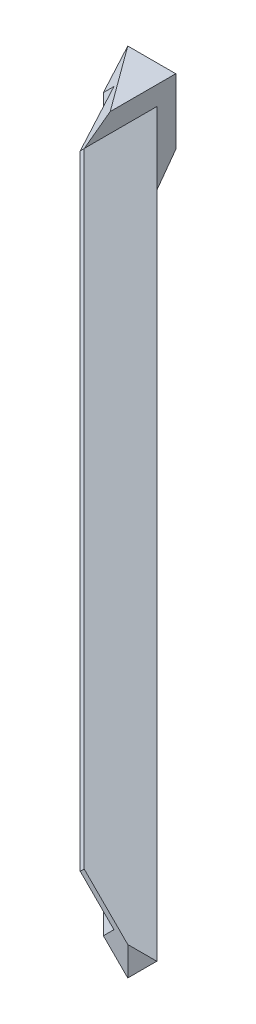
ISO-10303-21;
HEADER;
FILE_DESCRIPTION(('STEP AP214'),'2;1');
FILE_NAME('part.step','',(''),(''),'','','');
FILE_SCHEMA(('AUTOMOTIVE_DESIGN { 1 0 10303 214 1 1 1 1 }'));
ENDSEC;
DATA;
#1=APPLICATION_CONTEXT('core data for automotive mechanical design processes');
#2=APPLICATION_PROTOCOL_DEFINITION('international standard','automotive_design',2000,#1);
#3=PRODUCT_CONTEXT('',#1,'mechanical');
#4=PRODUCT('Part','Part','',(#3));
#5=PRODUCT_RELATED_PRODUCT_CATEGORY('part','',(#4));
#6=PRODUCT_DEFINITION_FORMATION('','',#4);
#7=PRODUCT_DEFINITION_CONTEXT('part definition',#1,'design');
#8=PRODUCT_DEFINITION('design','',#6,#7);
#9=PRODUCT_DEFINITION_SHAPE('','',#8);
#10=(LENGTH_UNIT() NAMED_UNIT(*) SI_UNIT(.MILLI.,.METRE.));
#11=(NAMED_UNIT(*) PLANE_ANGLE_UNIT() SI_UNIT($,.RADIAN.));
#12=(NAMED_UNIT(*) SI_UNIT($,.STERADIAN.) SOLID_ANGLE_UNIT());
#13=UNCERTAINTY_MEASURE_WITH_UNIT(LENGTH_MEASURE(1.E-05),#10,'distance_accuracy_value','');
#14=(GEOMETRIC_REPRESENTATION_CONTEXT(3) GLOBAL_UNCERTAINTY_ASSIGNED_CONTEXT((#13)) GLOBAL_UNIT_ASSIGNED_CONTEXT((#10,
#11,#12)) REPRESENTATION_CONTEXT('',''));
#15=CARTESIAN_POINT('',(0.,0.,0.));
#16=DIRECTION('',(0.,0.,1.));
#17=DIRECTION('',(1.,0.,0.));
#18=AXIS2_PLACEMENT_3D('',#15,#16,#17);
#19=CARTESIAN_POINT('',(0.,0.,0.));
#20=DIRECTION('',(0.,0.,1.));
#21=DIRECTION('',(1.,0.,0.));
#22=AXIS2_PLACEMENT_3D('',#19,#20,#21);
#23=PLANE('',#22);
#24=DIRECTION('',(-0.590690494568825,0.806898221355108,0.));
#25=VECTOR('',#24,1.);
#26=CARTESIAN_POINT('',(-105.561211175208,-77.2761698887505,0.));
#27=LINE('',#26,#25);
#28=CARTESIAN_POINT('',(-152.491152925207,-13.1686772601204,0.));
#29=VERTEX_POINT('',#28);
#30=CARTESIAN_POINT('',(-162.131293748091,0.,0.));
#31=VERTEX_POINT('',#30);
#32=EDGE_CURVE('E236',#29,#31,#27,.T.);
#33=ORIENTED_EDGE('',*,*,#32,.T.);
#34=DIRECTION('',(1.,0.,0.));
#35=VECTOR('',#34,1.);
#36=CARTESIAN_POINT('',(0.,0.,0.));
#37=LINE('',#36,#35);
#38=CARTESIAN_POINT('',(-152.491152925207,0.,0.));
#39=VERTEX_POINT('',#38);
#40=EDGE_CURVE('E169',#31,#39,#37,.T.);
#41=ORIENTED_EDGE('',*,*,#40,.T.);
#42=DIRECTION('',(0.,1.,0.));
#43=VECTOR('',#42,1.);
#44=CARTESIAN_POINT('',(-152.491152925207,-152.491152925207,0.));
#45=LINE('',#44,#43);
#46=EDGE_CURVE('E209',#29,#39,#45,.T.);
#47=ORIENTED_EDGE('',*,*,#46,.F.);
#48=EDGE_LOOP('',(#33,#41,#47));
#49=FACE_BOUND('',#48,.T.);
#50=ADVANCED_FACE('F36',(#49),#23,.F.);
#51=CARTESIAN_POINT('',(-1.47729270092566E-11,-81.0656468740469,-1.33553397631763E-11));
#52=DIRECTION('',(1.82234122330628E-13,1.,1.64747217572035E-13));
#53=DIRECTION('',(-1.,1.82234122330628E-13,0.));
#54=AXIS2_PLACEMENT_3D('',#51,#52,#53);
#55=PLANE('',#54);
#56=DIRECTION('',(-0.70710678118653,2.45352858390367E-13,-0.707106781186565));
#57=VECTOR('',#56,1.);
#58=CARTESIAN_POINT('',(-78.9443265305039,-81.0656468740455,78.9443265304718));
#59=LINE('',#58,#57);
#60=CARTESIAN_POINT('',(-83.843306016056,-81.0656468740414,74.0453470449194));
#61=VERTEX_POINT('',#60);
#62=CARTESIAN_POINT('',(-90.6100214304944,-81.0656468740414,67.2786316304807));
#63=VERTEX_POINT('',#62);
#64=EDGE_CURVE('E213',#61,#63,#59,.T.);
#65=ORIENTED_EDGE('',*,*,#64,.T.);
#66=DIRECTION('',(-0.707106781186565,0.,0.70710678118653));
#67=VECTOR('',#66,1.);
#68=CARTESIAN_POINT('',(-87.2424253850934,-81.0656468740416,63.9110355850798));
#69=LINE('',#68,#67);
#70=CARTESIAN_POINT('',(-89.8162713626104,-81.0656468740414,66.4848815625966));
#71=VERTEX_POINT('',#70);
#72=EDGE_CURVE('E11',#71,#63,#69,.T.);
#73=ORIENTED_EDGE('',*,*,#72,.F.);
#74=DIRECTION('',(-0.707106781186548,2.45352858390367E-13,-0.707106781186547));
#75=VECTOR('',#74,1.);
#76=CARTESIAN_POINT('',(1.30426382463766E-11,-81.0656468740726,156.30115292522));
#77=LINE('',#76,#75);
#78=CARTESIAN_POINT('',(-81.0656468740454,-81.0656468740454,75.2355060511616));
#79=VERTEX_POINT('',#78);
#80=EDGE_CURVE('E165',#79,#71,#77,.T.);
#81=ORIENTED_EDGE('',*,*,#80,.F.);
#82=DIRECTION('',(-1.64299320988016E-13,-1.64747217572005E-13,1.));
#83=VECTOR('',#82,1.);
#84=CARTESIAN_POINT('',(-81.0656468740321,-81.0656468740321,-2.66743705000292E-11));
#85=LINE('',#84,#83);
#86=CARTESIAN_POINT('',(-81.0656468740454,-81.0656468740454,81.0656468740454));
#87=VERTEX_POINT('',#86);
#88=EDGE_CURVE('E40',#79,#87,#85,.T.);
#89=ORIENTED_EDGE('',*,*,#88,.T.);
#90=DIRECTION('',(-0.707106781186547,2.45352858390367E-13,-0.707106781186548));
#91=VECTOR('',#90,1.);
#92=CARTESIAN_POINT('',(1.40606639392594E-11,-81.0656468740736,162.131293748105));
#93=LINE('',#92,#91);
#94=CARTESIAN_POINT('',(-85.9646263596137,-81.0656468740414,76.1666673884771));
#95=VERTEX_POINT('',#94);
#96=EDGE_CURVE('E136',#87,#95,#93,.T.);
#97=ORIENTED_EDGE('',*,*,#96,.T.);
#98=DIRECTION('',(-0.707106781186565,0.,0.70710678118653));
#99=VECTOR('',#98,1.);
#100=CARTESIAN_POINT('',(-83.843306016056,-81.0656468740414,74.0453470449194));
#101=LINE('',#100,#99);
#102=EDGE_CURVE('E45',#61,#95,#101,.T.);
#103=ORIENTED_EDGE('',*,*,#102,.F.);
#104=EDGE_LOOP('',(#65,#73,#81,#89,#97,#103));
#105=FACE_BOUND('',#104,.T.);
#106=ADVANCED_FACE('F163',(#105),#55,.F.);
#107=CARTESIAN_POINT('',(0.,0.,0.));
#108=DIRECTION('',(-0.707106781186546,0.,-0.707106781186549));
#109=DIRECTION('',(-0.707106781186549,0.,0.707106781186546));
#110=AXIS2_PLACEMENT_3D('',#107,#108,#109);
#111=PLANE('',#110);
#112=DIRECTION('',(0.,1.,0.));
#113=VECTOR('',#112,1.);
#114=CARTESIAN_POINT('',(-81.0656468740447,7.36469543671736E-12,81.065646874061));
#115=LINE('',#114,#113);
#116=CARTESIAN_POINT('',(-81.065646874061,-75.235506051146,81.065646874061));
#117=VERTEX_POINT('',#116);
#118=EDGE_CURVE('E151',#87,#117,#115,.T.);
#119=ORIENTED_EDGE('',*,*,#118,.F.);
#120=DIRECTION('',(-0.577350269189626,-0.577350269189626,0.577350269189626));
#121=VECTOR('',#120,1.);
#122=CARTESIAN_POINT('',(0.,0.,0.));
#123=LINE('',#122,#121);
#124=CARTESIAN_POINT('',(-78.1505764626035,-78.1505764626035,78.1505764626035));
#125=VERTEX_POINT('',#124);
#126=EDGE_CURVE('E154',#125,#87,#123,.T.);
#127=ORIENTED_EDGE('',*,*,#126,.F.);
#128=DIRECTION('',(0.577350269189626,-0.577350269189626,-0.577350269189626));
#129=VECTOR('',#128,1.);
#130=CARTESIAN_POINT('',(-78.1505764626035,-78.1505764626035,78.1505764626035));
#131=LINE('',#130,#129);
#132=EDGE_CURVE('E155',#117,#125,#131,.T.);
#133=ORIENTED_EDGE('',*,*,#132,.F.);
#134=EDGE_LOOP('',(#119,#127,#133));
#135=FACE_BOUND('',#134,.T.);
#136=ADVANCED_FACE('F152',(#135),#111,.F.);
#137=CARTESIAN_POINT('',(0.,0.,0.));
#138=DIRECTION('',(-0.707106781186548,0.707106781186547,0.));
#139=DIRECTION('',(-0.707106781186547,-0.707106781186548,0.));
#140=AXIS2_PLACEMENT_3D('',#137,#138,#139);
#141=PLANE('',#140);
#142=ORIENTED_EDGE('',*,*,#126,.T.);
#143=ORIENTED_EDGE('',*,*,#88,.F.);
#144=DIRECTION('',(0.577350269189626,0.577350269189626,0.577350269189626));
#145=VECTOR('',#144,1.);
#146=CARTESIAN_POINT('',(-78.1505764626035,-78.1505764626035,78.1505764626035));
#147=LINE('',#146,#145);
#148=EDGE_CURVE('E171',#79,#125,#147,.T.);
#149=ORIENTED_EDGE('',*,*,#148,.T.);
#150=EDGE_LOOP('',(#142,#143,#149));
#151=FACE_BOUND('',#150,.T.);
#152=ADVANCED_FACE('F170',(#151),#141,.F.);
#153=CARTESIAN_POINT('',(0.,0.,0.));
#154=DIRECTION('',(0.,1.,0.));
#155=DIRECTION('',(0.,0.,1.));
#156=AXIS2_PLACEMENT_3D('',#153,#154,#155);
#157=PLANE('',#156);
#158=DIRECTION('',(-0.590690494568928,-1.21765883643594E-13,-0.806898221355033));
#159=VECTOR('',#158,1.);
#160=CARTESIAN_POINT('',(-105.561211175189,1.15740750317173E-11,77.2761698887567));
#161=LINE('',#160,#159);
#162=CARTESIAN_POINT('',(-152.491152925207,2.64752456069495E-09,13.1686772565028));
#163=VERTEX_POINT('',#162);
#164=EDGE_CURVE('E146',#163,#31,#161,.T.);
#165=ORIENTED_EDGE('',*,*,#164,.F.);
#166=DIRECTION('',(0.,0.,-1.));
#167=VECTOR('',#166,1.);
#168=CARTESIAN_POINT('',(-152.491152925207,0.,-156.301152925207));
#169=LINE('',#168,#167);
#170=EDGE_CURVE('E215',#163,#39,#169,.T.);
#171=ORIENTED_EDGE('',*,*,#170,.T.);
#172=ORIENTED_EDGE('',*,*,#40,.F.);
#173=EDGE_LOOP('',(#165,#171,#172));
#174=FACE_BOUND('',#173,.T.);
#175=ADVANCED_FACE('F244',(#174),#157,.T.);
#176=CARTESIAN_POINT('',(-63.9344599594123,-46.8032730447621,-63.9344599594052));
#177=DIRECTION('',(-0.627963030199598,-0.459700843380959,-0.627963030199528));
#178=DIRECTION('',(-0.707106781186508,0.,0.707106781186587));
#179=AXIS2_PLACEMENT_3D('',#176,#177,#178);
#180=PLANE('',#179);
#181=DIRECTION('',(0.32505758367182,-0.888073833977128,0.325057583671882));
#182=VECTOR('',#181,1.);
#183=CARTESIAN_POINT('',(-142.878786489892,-46.8032730447553,15.0098665710785));
#184=LINE('',#183,#182);
#185=CARTESIAN_POINT('',(-157.181546279785,-7.72740661030851,0.707106781182764));
#186=VERTEX_POINT('',#185);
#187=CARTESIAN_POINT('',(-153.27478131373,-18.4008869908027,4.61387174723884));
#188=VERTEX_POINT('',#187);
#189=EDGE_CURVE('E210',#186,#188,#184,.T.);
#190=ORIENTED_EDGE('',*,*,#189,.F.);
#191=DIRECTION('',(-0.707106781186565,0.,0.70710678118653));
#192=VECTOR('',#191,1.);
#193=CARTESIAN_POINT('',(-157.181546279785,-7.72740661030851,0.707106781182764));
#194=LINE('',#193,#192);
#195=CARTESIAN_POINT('',(-159.302866623347,-7.72740661030836,2.82842712474405));
#196=VERTEX_POINT('',#195);
#197=EDGE_CURVE('E229',#186,#196,#194,.T.);
#198=ORIENTED_EDGE('',*,*,#197,.T.);
#199=DIRECTION('',(0.325057583671851,-0.888073833977128,0.325057583671851));
#200=VECTOR('',#199,1.);
#201=CARTESIAN_POINT('',(-81.0656468740509,-221.475466008329,81.0656468740399));
#202=LINE('',#201,#200);
#203=EDGE_CURVE('E217',#31,#196,#202,.T.);
#204=ORIENTED_EDGE('',*,*,#203,.F.);
#205=ORIENTED_EDGE('',*,*,#32,.F.);
#206=DIRECTION('',(0.,-0.806898221355077,0.590690494568868));
#207=VECTOR('',#206,1.);
#208=CARTESIAN_POINT('',(-152.491152925207,-29.3820483318513,11.8690113864744));
#209=LINE('',#208,#207);
#210=CARTESIAN_POINT('',(-152.491152925207,-18.3732340485391,3.80999999999998));
#211=VERTEX_POINT('',#210);
#212=EDGE_CURVE('E211',#29,#211,#209,.T.);
#213=ORIENTED_EDGE('',*,*,#212,.T.);
#214=DIRECTION('',(0.325057583671851,-0.888073833977128,0.325057583671851));
#215=VECTOR('',#214,1.);
#216=CARTESIAN_POINT('',(-80.4496200117063,-215.194362223382,75.8515329135007));
#217=LINE('',#216,#215);
#218=CARTESIAN_POINT('',(-152.481031245849,-18.4008869908027,3.8201216793579));
#219=VERTEX_POINT('',#218);
#220=EDGE_CURVE('E145',#211,#219,#217,.T.);
#221=ORIENTED_EDGE('',*,*,#220,.T.);
#222=DIRECTION('',(-0.707106781186565,0.,0.70710678118653));
#223=VECTOR('',#222,1.);
#224=CARTESIAN_POINT('',(-149.907185268329,-18.4008869908029,1.24627570183799));
#225=LINE('',#224,#223);
#226=EDGE_CURVE('E232',#219,#188,#225,.T.);
#227=ORIENTED_EDGE('',*,*,#226,.T.);
#228=EDGE_LOOP('',(#190,#198,#204,#205,#213,#221,#227));
#229=FACE_BOUND('',#228,.T.);
#230=ADVANCED_FACE('F253',(#229),#180,.T.);
#231=CARTESIAN_POINT('',(-87.2424253850932,-63.9110355850799,81.0656468740418));
#232=DIRECTION('',(-0.408248290463873,0.408248290463853,0.816496580927726));
#233=DIRECTION('',(0.894427190999912,0.,0.447213595499966));
#234=AXIS2_PLACEMENT_3D('',#231,#232,#233);
#235=PLANE('',#234);
#236=DIRECTION('',(-0.577350269189599,0.577350269189653,-0.577350269189625));
#237=VECTOR('',#236,1.);
#238=CARTESIAN_POINT('',(-90.6100214304942,-67.2786316304808,81.0656468740416));
#239=LINE('',#238,#237);
#240=CARTESIAN_POINT('',(-90.6100214304942,-67.2786316304808,81.0656468740416));
#241=VERTEX_POINT('',#240);
#242=CARTESIAN_POINT('',(-153.27478131373,-4.61387174723914,18.400886990803));
#243=VERTEX_POINT('',#242);
#244=EDGE_CURVE('E273',#241,#243,#239,.T.);
#245=ORIENTED_EDGE('',*,*,#244,.F.);
#246=DIRECTION('',(-0.707106781186564,-0.707106781186531,0.));
#247=VECTOR('',#246,1.);
#248=CARTESIAN_POINT('',(-87.2424253850932,-63.9110355850799,81.0656468740418));
#249=LINE('',#248,#247);
#250=CARTESIAN_POINT('',(-89.8162713626101,-66.484881562597,81.0656468740418));
#251=VERTEX_POINT('',#250);
#252=EDGE_CURVE('E160',#251,#241,#249,.T.);
#253=ORIENTED_EDGE('',*,*,#252,.F.);
#254=DIRECTION('',(0.577350269189626,-0.577350269189626,0.577350269189626));
#255=VECTOR('',#254,1.);
#256=CARTESIAN_POINT('',(-89.8162713626101,-66.4848815625969,81.0656468740418));
#257=LINE('',#256,#255);
#258=CARTESIAN_POINT('',(-152.481031245849,-3.82012167935811,18.400886990803));
#259=VERTEX_POINT('',#258);
#260=EDGE_CURVE('E196',#259,#251,#257,.T.);
#261=ORIENTED_EDGE('',*,*,#260,.F.);
#262=DIRECTION('',(-0.707106781186564,-0.707106781186531,0.));
#263=VECTOR('',#262,1.);
#264=CARTESIAN_POINT('',(-149.907185268329,-1.24627570183828,18.4008869908031));
#265=LINE('',#264,#263);
#266=EDGE_CURVE('E267',#259,#243,#265,.T.);
#267=ORIENTED_EDGE('',*,*,#266,.T.);
#268=EDGE_LOOP('',(#245,#253,#261,#267));
#269=FACE_BOUND('',#268,.T.);
#270=ADVANCED_FACE('F294',(#269),#235,.T.);
#271=CARTESIAN_POINT('',(-156.301152925207,0.,156.301152925207));
#272=DIRECTION('',(-0.707106781186547,-0.707106781186548,0.));
#273=DIRECTION('',(0.,0.,-1.));
#274=AXIS2_PLACEMENT_3D('',#271,#272,#273);
#275=PLANE('',#274);
#276=ORIENTED_EDGE('',*,*,#260,.T.);
#277=DIRECTION('',(-0.707106781186548,0.707106781186547,0.));
#278=VECTOR('',#277,1.);
#279=CARTESIAN_POINT('',(-156.301152925207,0.,81.065646874061));
#280=LINE('',#279,#278);
#281=EDGE_CURVE('E203',#117,#251,#280,.T.);
#282=ORIENTED_EDGE('',*,*,#281,.F.);
#283=ORIENTED_EDGE('',*,*,#132,.T.);
#284=DIRECTION('',(0.577350269189626,-0.577350269189626,0.577350269189626));
#285=VECTOR('',#284,1.);
#286=CARTESIAN_POINT('',(0.,-156.301152925207,156.301152925207));
#287=LINE('',#286,#285);
#288=CARTESIAN_POINT('',(-152.491152925207,-3.80999999999998,3.81000000000001));
#289=VERTEX_POINT('',#288);
#290=EDGE_CURVE('E271',#289,#125,#287,.T.);
#291=ORIENTED_EDGE('',*,*,#290,.F.);
#292=DIRECTION('',(0.,0.,-1.));
#293=VECTOR('',#292,1.);
#294=CARTESIAN_POINT('',(-152.491152925207,-3.80999999999998,156.301152925207));
#295=LINE('',#294,#293);
#296=CARTESIAN_POINT('',(-152.491152925207,-3.81000000000001,18.3732340485388));
#297=VERTEX_POINT('',#296);
#298=EDGE_CURVE('E201',#297,#289,#295,.T.);
#299=ORIENTED_EDGE('',*,*,#298,.F.);
#300=DIRECTION('',(0.325057583671846,-0.325057583671846,0.888073833977132));
#301=VECTOR('',#300,1.);
#302=CARTESIAN_POINT('',(-113.479940116298,-42.821212808909,124.953849507369));
#303=LINE('',#302,#301);
#304=EDGE_CURVE('E283',#297,#259,#303,.T.);
#305=ORIENTED_EDGE('',*,*,#304,.T.);
#306=EDGE_LOOP('',(#276,#282,#283,#291,#299,#305));
#307=FACE_BOUND('',#306,.T.);
#308=ADVANCED_FACE('F289',(#307),#275,.F.);
#309=CARTESIAN_POINT('',(-162.131293748091,0.,162.131293748091));
#310=DIRECTION('',(-0.707106781186548,-0.707106781186547,0.));
#311=DIRECTION('',(0.,0.,-1.));
#312=AXIS2_PLACEMENT_3D('',#309,#310,#311);
#313=PLANE('',#312);
#314=DIRECTION('',(0.577350269189626,-0.577350269189626,0.577350269189626));
#315=VECTOR('',#314,1.);
#316=CARTESIAN_POINT('',(0.,-162.131293748091,162.131293748091));
#317=LINE('',#316,#315);
#318=EDGE_CURVE('E141',#31,#87,#317,.T.);
#319=ORIENTED_EDGE('',*,*,#318,.T.);
#320=DIRECTION('',(-0.707106781186547,0.707106781186548,0.));
#321=VECTOR('',#320,1.);
#322=CARTESIAN_POINT('',(-162.131293748091,0.,81.065646874061));
#323=LINE('',#322,#321);
#324=CARTESIAN_POINT('',(-85.9646263596136,-76.1666673884772,81.0656468740415));
#325=VERTEX_POINT('',#324);
#326=EDGE_CURVE('E175',#87,#325,#323,.T.);
#327=ORIENTED_EDGE('',*,*,#326,.T.);
#328=DIRECTION('',(-0.577350269189626,0.577350269189626,-0.577350269189626));
#329=VECTOR('',#328,1.);
#330=CARTESIAN_POINT('',(-109.720522327249,-52.4107714208421,57.3097509064065));
#331=LINE('',#330,#329);
#332=CARTESIAN_POINT('',(-159.302866623346,-2.82842712474424,7.72740661030869));
#333=VERTEX_POINT('',#332);
#334=EDGE_CURVE('E192',#325,#333,#331,.T.);
#335=ORIENTED_EDGE('',*,*,#334,.T.);
#336=DIRECTION('',(0.325057583671846,-0.325057583671846,0.888073833977132));
#337=VECTOR('',#336,1.);
#338=CARTESIAN_POINT('',(-115.328020703332,-46.8032730447589,127.868919918811));
#339=LINE('',#338,#337);
#340=EDGE_CURVE('E186',#31,#333,#339,.T.);
#341=ORIENTED_EDGE('',*,*,#340,.F.);
#342=EDGE_LOOP('',(#319,#327,#335,#341));
#343=FACE_BOUND('',#342,.T.);
#344=ADVANCED_FACE('F184',(#343),#313,.T.);
#345=CARTESIAN_POINT('',(-83.8433060160558,-74.0453470449194,81.0656468740416));
#346=DIRECTION('',(-0.408248290463873,0.408248290463853,0.816496580927726));
#347=DIRECTION('',(0.894427190999912,0.,0.447213595499966));
#348=AXIS2_PLACEMENT_3D('',#345,#346,#347);
#349=PLANE('',#348);
#350=ORIENTED_EDGE('',*,*,#334,.F.);
#351=DIRECTION('',(-0.707106781186564,-0.707106781186531,0.));
#352=VECTOR('',#351,1.);
#353=CARTESIAN_POINT('',(-83.8433060160558,-74.0453470449194,81.0656468740416));
#354=LINE('',#353,#352);
#355=CARTESIAN_POINT('',(-83.8433060160558,-74.0453470449194,81.0656468740416));
#356=VERTEX_POINT('',#355);
#357=EDGE_CURVE('E179',#356,#325,#354,.T.);
#358=ORIENTED_EDGE('',*,*,#357,.F.);
#359=DIRECTION('',(-0.577350269189599,0.577350269189653,-0.577350269189625));
#360=VECTOR('',#359,1.);
#361=CARTESIAN_POINT('',(-83.8433060160558,-74.0453470449194,81.0656468740416));
#362=LINE('',#361,#360);
#363=CARTESIAN_POINT('',(-157.181546279785,-0.707106781183089,7.72740661030879));
#364=VERTEX_POINT('',#363);
#365=EDGE_CURVE('E276',#356,#364,#362,.T.);
#366=ORIENTED_EDGE('',*,*,#365,.T.);
#367=DIRECTION('',(-0.707106781186564,-0.707106781186531,0.));
#368=VECTOR('',#367,1.);
#369=CARTESIAN_POINT('',(-157.181546279785,-0.707106781183089,7.72740661030879));
#370=LINE('',#369,#368);
#371=EDGE_CURVE('E265',#364,#333,#370,.T.);
#372=ORIENTED_EDGE('',*,*,#371,.T.);
#373=EDGE_LOOP('',(#350,#358,#366,#372));
#374=FACE_BOUND('',#373,.T.);
#375=ADVANCED_FACE('F298',(#374),#349,.T.);
#376=CARTESIAN_POINT('',(-78.9443265304876,-78.944326530484,-3.71847269865436E-12));
#377=DIRECTION('',(-0.707106781186564,-0.707106781186531,0.));
#378=DIRECTION('',(-0.707106781186531,0.707106781186564,0.));
#379=AXIS2_PLACEMENT_3D('',#376,#377,#378);
#380=PLANE('',#379);
#381=ORIENTED_EDGE('',*,*,#365,.F.);
#382=DIRECTION('',(-0.707106781186531,0.707106781186564,0.));
#383=VECTOR('',#382,1.);
#384=CARTESIAN_POINT('',(-78.9443265304896,-78.9443265304859,81.065646874061));
#385=LINE('',#384,#383);
#386=EDGE_CURVE('E182',#356,#241,#385,.T.);
#387=ORIENTED_EDGE('',*,*,#386,.T.);
#388=ORIENTED_EDGE('',*,*,#244,.T.);
#389=DIRECTION('',(0.325057583671817,-0.325057583671874,0.888073833977132));
#390=VECTOR('',#389,1.);
#391=CARTESIAN_POINT('',(-142.878786489892,-15.0098665710783,46.8032730447548));
#392=LINE('',#391,#390);
#393=EDGE_CURVE('E219',#364,#243,#392,.T.);
#394=ORIENTED_EDGE('',*,*,#393,.F.);
#395=EDGE_LOOP('',(#381,#387,#388,#394));
#396=FACE_BOUND('',#395,.T.);
#397=ADVANCED_FACE('F296',(#396),#380,.T.);
#398=CARTESIAN_POINT('',(-2.22799097931636E-11,6.68963210030669E-12,81.065646874061));
#399=DIRECTION('',(0.,0.,1.));
#400=DIRECTION('',(1.,0.,0.));
#401=AXIS2_PLACEMENT_3D('',#398,#399,#400);
#402=PLANE('',#401);
#403=ORIENTED_EDGE('',*,*,#386,.F.);
#404=ORIENTED_EDGE('',*,*,#357,.T.);
#405=ORIENTED_EDGE('',*,*,#326,.F.);
#406=ORIENTED_EDGE('',*,*,#118,.T.);
#407=ORIENTED_EDGE('',*,*,#281,.T.);
#408=ORIENTED_EDGE('',*,*,#252,.T.);
#409=EDGE_LOOP('',(#403,#404,#405,#406,#407,#408));
#410=FACE_BOUND('',#409,.T.);
#411=ADVANCED_FACE('F177',(#410),#402,.T.);
#412=CARTESIAN_POINT('',(-152.491152925207,-152.491152925207,-156.301152925207));
#413=DIRECTION('',(-1.,0.,0.));
#414=DIRECTION('',(0.,0.,1.));
#415=AXIS2_PLACEMENT_3D('',#412,#413,#414);
#416=PLANE('',#415);
#417=ORIENTED_EDGE('',*,*,#212,.F.);
#418=ORIENTED_EDGE('',*,*,#46,.T.);
#419=ORIENTED_EDGE('',*,*,#170,.F.);
#420=DIRECTION('',(0.,-0.590690494568829,0.806898221355105));
#421=VECTOR('',#420,1.);
#422=CARTESIAN_POINT('',(-152.491152925207,27.5674249707177,-24.4891255668067));
#423=LINE('',#422,#421);
#424=EDGE_CURVE('E249',#163,#297,#423,.T.);
#425=ORIENTED_EDGE('',*,*,#424,.T.);
#426=ORIENTED_EDGE('',*,*,#298,.T.);
#427=DIRECTION('',(0.,-1.,0.));
#428=VECTOR('',#427,1.);
#429=CARTESIAN_POINT('',(-152.491152925207,-156.301152925207,3.80999999999995));
#430=LINE('',#429,#428);
#431=EDGE_CURVE('E53',#289,#211,#430,.T.);
#432=ORIENTED_EDGE('',*,*,#431,.T.);
#433=EDGE_LOOP('',(#417,#418,#419,#425,#426,#432));
#434=FACE_BOUND('',#433,.T.);
#435=ADVANCED_FACE('F247',(#434),#416,.F.);
#436=CARTESIAN_POINT('',(0.,-162.131293748091,162.131293748091));
#437=DIRECTION('',(-0.707106781186548,0.,0.707106781186547));
#438=DIRECTION('',(0.,1.,0.));
#439=AXIS2_PLACEMENT_3D('',#436,#437,#438);
#440=PLANE('',#439);
#441=ORIENTED_EDGE('',*,*,#318,.F.);
#442=ORIENTED_EDGE('',*,*,#203,.T.);
#443=DIRECTION('',(-0.577350269189626,0.577350269189626,-0.577350269189626));
#444=VECTOR('',#443,1.);
#445=CARTESIAN_POINT('',(-1.63299316185472,-165.3972800718,160.498300586236));
#446=LINE('',#445,#444);
#447=EDGE_CURVE('E143',#95,#196,#446,.T.);
#448=ORIENTED_EDGE('',*,*,#447,.F.);
#449=ORIENTED_EDGE('',*,*,#96,.F.);
#450=EDGE_LOOP('',(#441,#442,#448,#449));
#451=FACE_BOUND('',#450,.T.);
#452=ADVANCED_FACE('F138',(#451),#440,.T.);
#453=CARTESIAN_POINT('',(-78.9443265304878,3.96544140042022E-12,78.9443265304838));
#454=DIRECTION('',(-0.707106781186566,0.,0.70710678118653));
#455=DIRECTION('',(-0.70710678118653,0.,-0.707106781186565));
#456=AXIS2_PLACEMENT_3D('',#453,#454,#455);
#457=PLANE('',#456);
#458=DIRECTION('',(-0.577350269189597,0.577350269189626,-0.577350269189655));
#459=VECTOR('',#458,1.);
#460=CARTESIAN_POINT('',(-83.843306016056,-81.0656468740414,74.0453470449194));
#461=LINE('',#460,#459);
#462=EDGE_CURVE('E188',#61,#186,#461,.T.);
#463=ORIENTED_EDGE('',*,*,#462,.T.);
#464=ORIENTED_EDGE('',*,*,#189,.T.);
#465=DIRECTION('',(-0.577350269189597,0.577350269189626,-0.577350269189655));
#466=VECTOR('',#465,1.);
#467=CARTESIAN_POINT('',(-90.6100214304944,-81.0656468740414,67.2786316304807));
#468=LINE('',#467,#466);
#469=EDGE_CURVE('E190',#63,#188,#468,.T.);
#470=ORIENTED_EDGE('',*,*,#469,.F.);
#471=ORIENTED_EDGE('',*,*,#64,.F.);
#472=EDGE_LOOP('',(#463,#464,#470,#471));
#473=FACE_BOUND('',#472,.T.);
#474=ADVANCED_FACE('F323',(#473),#457,.T.);
#475=CARTESIAN_POINT('',(0.,-156.301152925207,156.301152925207));
#476=DIRECTION('',(-0.707106781186547,0.,0.707106781186548));
#477=DIRECTION('',(0.,1.,0.));
#478=AXIS2_PLACEMENT_3D('',#475,#476,#477);
#479=PLANE('',#478);
#480=ORIENTED_EDGE('',*,*,#220,.F.);
#481=ORIENTED_EDGE('',*,*,#431,.F.);
#482=ORIENTED_EDGE('',*,*,#290,.T.);
#483=ORIENTED_EDGE('',*,*,#148,.F.);
#484=ORIENTED_EDGE('',*,*,#80,.T.);
#485=DIRECTION('',(0.577350269189626,-0.577350269189626,0.577350269189626));
#486=VECTOR('',#485,1.);
#487=CARTESIAN_POINT('',(-89.8162713626103,-81.0656468740415,66.4848815625967));
#488=LINE('',#487,#486);
#489=EDGE_CURVE('E198',#219,#71,#488,.T.);
#490=ORIENTED_EDGE('',*,*,#489,.F.);
#491=EDGE_LOOP('',(#480,#481,#482,#483,#484,#490));
#492=FACE_BOUND('',#491,.T.);
#493=ADVANCED_FACE('F38',(#492),#479,.F.);
#494=CARTESIAN_POINT('',(-87.2424253850934,-81.0656468740416,63.9110355850798));
#495=DIRECTION('',(0.408248290463873,0.816496580927726,0.408248290463853));
#496=DIRECTION('',(-0.894427190999912,0.447213595499967,0.));
#497=AXIS2_PLACEMENT_3D('',#494,#495,#496);
#498=PLANE('',#497);
#499=ORIENTED_EDGE('',*,*,#489,.T.);
#500=ORIENTED_EDGE('',*,*,#72,.T.);
#501=ORIENTED_EDGE('',*,*,#469,.T.);
#502=ORIENTED_EDGE('',*,*,#226,.F.);
#503=EDGE_LOOP('',(#499,#500,#501,#502));
#504=FACE_BOUND('',#503,.T.);
#505=ADVANCED_FACE('F256',(#504),#498,.F.);
#506=CARTESIAN_POINT('',(-83.843306016056,-81.0656468740414,74.0453470449194));
#507=DIRECTION('',(0.408248290463873,0.816496580927726,0.408248290463853));
#508=DIRECTION('',(-0.894427190999911,0.447213595499967,0.));
#509=AXIS2_PLACEMENT_3D('',#506,#507,#508);
#510=PLANE('',#509);
#511=ORIENTED_EDGE('',*,*,#462,.F.);
#512=ORIENTED_EDGE('',*,*,#102,.T.);
#513=ORIENTED_EDGE('',*,*,#447,.T.);
#514=ORIENTED_EDGE('',*,*,#197,.F.);
#515=EDGE_LOOP('',(#511,#512,#513,#514));
#516=FACE_BOUND('',#515,.T.);
#517=ADVANCED_FACE('F264',(#516),#510,.F.);
#518=CARTESIAN_POINT('',(-63.9344599594024,63.9344599594057,46.8032730447577));
#519=DIRECTION('',(0.62796303019955,-0.627963030199582,-0.459700843380951));
#520=DIRECTION('',(0.707106781186566,0.707106781186529,0.));
#521=AXIS2_PLACEMENT_3D('',#518,#519,#520);
#522=PLANE('',#521);
#523=ORIENTED_EDGE('',*,*,#164,.T.);
#524=ORIENTED_EDGE('',*,*,#340,.T.);
#525=ORIENTED_EDGE('',*,*,#371,.F.);
#526=ORIENTED_EDGE('',*,*,#393,.T.);
#527=ORIENTED_EDGE('',*,*,#266,.F.);
#528=ORIENTED_EDGE('',*,*,#304,.F.);
#529=ORIENTED_EDGE('',*,*,#424,.F.);
#530=EDGE_LOOP('',(#523,#524,#525,#526,#527,#528,#529));
#531=FACE_BOUND('',#530,.T.);
#532=ADVANCED_FACE('F301',(#531),#522,.F.);
#533=CLOSED_SHELL('',(#50,#106,#136,#152,#175,#230,#270,#308,#344,#375,#397,#411,#435,#452,#474,
#493,#505,#517,#532));
#534=MANIFOLD_SOLID_BREP('B2',#533);
#535=ADVANCED_BREP_SHAPE_REPRESENTATION('',(#18,#534),#14);
#536=SHAPE_DEFINITION_REPRESENTATION(#9,#535);
ENDSEC;
END-ISO-10303-21;
